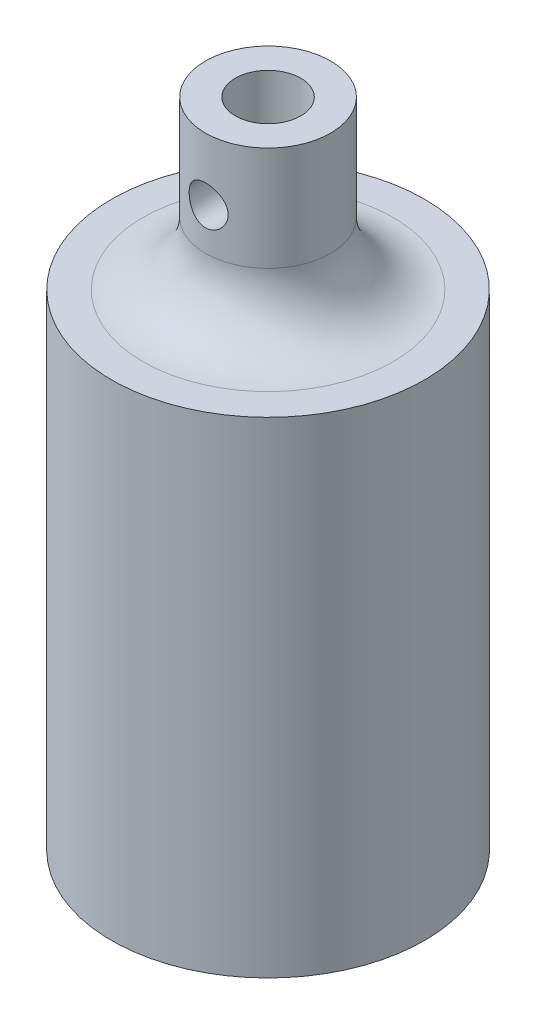
ISO-10303-21;
HEADER;
FILE_DESCRIPTION(('STEP AP214'),'2;1');
FILE_NAME('part.step','',(''),(''),'','','');
FILE_SCHEMA(('AUTOMOTIVE_DESIGN { 1 0 10303 214 1 1 1 1 }'));
ENDSEC;
DATA;
#1=APPLICATION_CONTEXT('core data for automotive mechanical design processes');
#2=APPLICATION_PROTOCOL_DEFINITION('international standard','automotive_design',2000,#1);
#3=PRODUCT_CONTEXT('',#1,'mechanical');
#4=PRODUCT('Part','Part','',(#3));
#5=PRODUCT_RELATED_PRODUCT_CATEGORY('part','',(#4));
#6=PRODUCT_DEFINITION_FORMATION('','',#4);
#7=PRODUCT_DEFINITION_CONTEXT('part definition',#1,'design');
#8=PRODUCT_DEFINITION('design','',#6,#7);
#9=PRODUCT_DEFINITION_SHAPE('','',#8);
#10=(LENGTH_UNIT() NAMED_UNIT(*) SI_UNIT(.MILLI.,.METRE.));
#11=(NAMED_UNIT(*) PLANE_ANGLE_UNIT() SI_UNIT($,.RADIAN.));
#12=(NAMED_UNIT(*) SI_UNIT($,.STERADIAN.) SOLID_ANGLE_UNIT());
#13=UNCERTAINTY_MEASURE_WITH_UNIT(LENGTH_MEASURE(1.E-05),#10,'distance_accuracy_value','');
#14=(GEOMETRIC_REPRESENTATION_CONTEXT(3) GLOBAL_UNCERTAINTY_ASSIGNED_CONTEXT((#13)) GLOBAL_UNIT_ASSIGNED_CONTEXT((#10,
#11,#12)) REPRESENTATION_CONTEXT('',''));
#15=CARTESIAN_POINT('',(0.,0.,0.));
#16=DIRECTION('',(0.,0.,1.));
#17=DIRECTION('',(1.,0.,0.));
#18=AXIS2_PLACEMENT_3D('',#15,#16,#17);
#19=CARTESIAN_POINT('',(0.,27.051,0.));
#20=DIRECTION('',(0.,1.,0.));
#21=DIRECTION('',(0.,0.,1.));
#22=AXIS2_PLACEMENT_3D('',#19,#20,#21);
#23=CYLINDRICAL_SURFACE('',#22,1.9939);
#24=CARTESIAN_POINT('',(0.,34.75355,1.9939));
#25=CARTESIAN_POINT('',(0.060814080758455,34.753552976939,1.99389728634744));
#26=CARTESIAN_POINT('',(0.121729723461206,34.7582546610524,1.9910872540621));
#27=CARTESIAN_POINT('',(0.241734607671098,34.7768231490229,1.98011440367248));
#28=CARTESIAN_POINT('',(0.300818769700695,34.7907134047522,1.97193788918477));
#29=CARTESIAN_POINT('',(0.415163546592239,34.8268839318832,1.95106073933573));
#30=CARTESIAN_POINT('',(0.470441522487163,34.8491226423559,1.93838253131428));
#31=CARTESIAN_POINT('',(0.57631031758627,34.901103309333,1.90958568878356));
#32=CARTESIAN_POINT('',(0.626902412867362,34.9308432148209,1.89346799490196));
#33=CARTESIAN_POINT('',(0.726307907612821,34.9994930165202,1.85771654573183));
#34=CARTESIAN_POINT('',(0.774695428736959,35.0389273053155,1.83790883757242));
#35=CARTESIAN_POINT('',(0.864585787833343,35.1246702051813,1.79737738898154));
#36=CARTESIAN_POINT('',(0.906079736858757,35.1709875481411,1.77665250881824));
#37=CARTESIAN_POINT('',(0.986068931893715,35.2757494431779,1.73366770815641));
#38=CARTESIAN_POINT('',(1.02360179904558,35.3349826750206,1.71152335531735));
#39=CARTESIAN_POINT('',(1.08803607896177,35.4602167274675,1.67130597699134));
#40=CARTESIAN_POINT('',(1.11495459495701,35.5262064431802,1.65322642214665));
#41=CARTESIAN_POINT('',(1.1517823394664,35.6470303880968,1.62770148288906));
#42=CARTESIAN_POINT('',(1.1642163154199,35.7007753614492,1.61874863175566));
#43=CARTESIAN_POINT('',(1.18149998436242,35.8100574660265,1.60617987435283));
#44=CARTESIAN_POINT('',(1.1863588916258,35.8655923359279,1.60255748443951));
#45=CARTESIAN_POINT('',(1.18821365755399,35.9769712587273,1.60118314972899));
#46=CARTESIAN_POINT('',(1.18519490009591,36.0328156942389,1.60344211711236));
#47=CARTESIAN_POINT('',(1.17145389992644,36.1430489851447,1.61350601234345));
#48=CARTESIAN_POINT('',(1.16072593727979,36.1974367286312,1.62131505808973));
#49=CARTESIAN_POINT('',(1.13229550881869,36.3027889231089,1.64129151245478));
#50=CARTESIAN_POINT('',(1.11467360645707,36.3537852284231,1.65340843457949));
#51=CARTESIAN_POINT('',(1.07309589389807,36.4522356728708,1.68069016266906));
#52=CARTESIAN_POINT('',(1.0491377455373,36.4996884961034,1.6958560932642));
#53=CARTESIAN_POINT('',(0.990799995367289,36.5984065230596,1.73069189249639));
#54=CARTESIAN_POINT('',(0.955335378866602,36.6489160688574,1.75068733512774));
#55=CARTESIAN_POINT('',(0.877130737946455,36.7437850757379,1.79115071606564));
#56=CARTESIAN_POINT('',(0.83438386698707,36.7881386773281,1.81161908320209));
#57=CARTESIAN_POINT('',(0.735952148011846,36.8755075679961,1.85398299164306));
#58=CARTESIAN_POINT('',(0.679299557671739,36.9175321441066,1.87569764304425));
#59=CARTESIAN_POINT('',(0.558416773681963,36.991339411579,1.91516072064334));
#60=CARTESIAN_POINT('',(0.494190804671451,37.0231277764025,1.93291134224284));
#61=CARTESIAN_POINT('',(0.364135048833109,37.0732453989736,1.96142370241393));
#62=CARTESIAN_POINT('',(0.298673735748199,37.0923084648734,1.97256134411408));
#63=CARTESIAN_POINT('',(0.164711185128663,37.1189455909947,1.98822434786049));
#64=CARTESIAN_POINT('',(0.0962135809522436,37.1265330207913,1.99275740428645));
#65=CARTESIAN_POINT('',(-0.0319449381101245,37.1295144132842,1.99453476074334));
#66=CARTESIAN_POINT('',(-0.0915646937674483,37.1264010603245,1.99267136924459));
#67=CARTESIAN_POINT('',(-0.209279074699433,37.111366975179,1.98376445536487));
#68=CARTESIAN_POINT('',(-0.26737372042157,37.0994463611364,1.97672100247087));
#69=CARTESIAN_POINT('',(-0.37921012419484,37.0677408990812,1.9583113351594));
#70=CARTESIAN_POINT('',(-0.43301939265196,37.0481342036212,1.94704328251747));
#71=CARTESIAN_POINT('',(-0.536580925037923,37.001819955291,1.92108598956423));
#72=CARTESIAN_POINT('',(-0.586332360851174,36.9751109577096,1.90639605326763));
#73=CARTESIAN_POINT('',(-0.685957592064811,36.9122474718216,1.87300257772166));
#74=CARTESIAN_POINT('',(-0.735305977369007,36.8753995278818,1.85404050787109));
#75=CARTESIAN_POINT('',(-0.827495298580985,36.7948404431378,1.81477415436333));
#76=CARTESIAN_POINT('',(-0.87032852955923,36.7511212986244,1.79446832163692));
#77=CARTESIAN_POINT('',(-0.953883512416788,36.6515566989156,1.75163236729128));
#78=CARTESIAN_POINT('',(-0.993639988539951,36.5948758668906,1.72914868989201));
#79=CARTESIAN_POINT('',(-1.06307421767295,36.4745906424851,1.6873517879675));
#80=CARTESIAN_POINT('',(-1.09276312466667,36.4109940160904,1.66803506707367));
#81=CARTESIAN_POINT('',(-1.13557724960321,36.2925183892995,1.63909138589378));
#82=CARTESIAN_POINT('',(-1.15089555351417,36.2387260322072,1.62827250038024));
#83=CARTESIAN_POINT('',(-1.17384727930482,36.1287848261933,1.61180768195928));
#84=CARTESIAN_POINT('',(-1.18149107189453,36.07263926444,1.60615476910756));
#85=CARTESIAN_POINT('',(-1.18866842936369,35.9593406532707,1.60085205935446));
#86=CARTESIAN_POINT('',(-1.18817397563399,35.902184800297,1.60122300151114));
#87=CARTESIAN_POINT('',(-1.17903791001395,35.7888756751246,1.60796018505792));
#88=CARTESIAN_POINT('',(-1.170391685584,35.732722988881,1.61432982070356));
#89=CARTESIAN_POINT('',(-1.14600324288999,35.6253782394202,1.63172383254599));
#90=CARTESIAN_POINT('',(-1.13058158924804,35.5740767052315,1.64253664242094));
#91=CARTESIAN_POINT('',(-1.09336585540144,35.4747319746394,1.66753988333922));
#92=CARTESIAN_POINT('',(-1.07156938388729,35.426690009306,1.68173158149255));
#93=CARTESIAN_POINT('',(-1.01835857867829,35.3272955849823,1.71455597977209));
#94=CARTESIAN_POINT('',(-0.985979338297984,35.2765753738422,1.73353603953796));
#95=CARTESIAN_POINT('',(-0.914167365336964,35.1807869454974,1.772457592727));
#96=CARTESIAN_POINT('',(-0.874728872751776,35.1357233953219,1.79239986148618));
#97=CARTESIAN_POINT('',(-0.782625131594729,35.0452723605275,1.83468988459786));
#98=CARTESIAN_POINT('',(-0.728855371004508,35.0009452945681,1.85692360236287));
#99=CARTESIAN_POINT('',(-0.613480643185146,34.9219007985321,1.89816399618569));
#100=CARTESIAN_POINT('',(-0.551873171503263,34.8871864514048,1.91716963619461));
#101=CARTESIAN_POINT('',(-0.424554005810462,34.8299241039312,1.94924270454899));
#102=CARTESIAN_POINT('',(-0.359065413800211,34.8069882202629,1.96249685831109));
#103=CARTESIAN_POINT('',(-0.224269242714761,34.7728669266873,1.98240742376365));
#104=CARTESIAN_POINT('',(-0.154977243367004,34.7616368693736,1.9890888988971));
#105=CARTESIAN_POINT('',(-0.0710568489889702,34.7555917145108,1.99268489380089));
#106=CARTESIAN_POINT('',(-0.0568618851108963,34.7548269399076,1.99313977429374));
#107=CARTESIAN_POINT('',(-0.0284464671490795,34.7538057275825,1.99374764887506));
#108=CARTESIAN_POINT('',(-0.0142260123860088,34.7535493036157,1.99390063479468));
#109=CARTESIAN_POINT('',(0.,34.75355,1.9939));
#110=B_SPLINE_CURVE_WITH_KNOTS('',3,(#24,#25,#26,#27,#28,#29,#30,#31,#32,#33,#34,#35,#36,#37,
#38,#39,#40,#41,#42,#43,#44,#45,#46,#47,#48,#49,#50,#51,#52,#53,#54,#55,#56,#57,#58,#59,#60,#61,
#62,#63,#64,#65,#66,#67,#68,#69,#70,#71,#72,#73,#74,#75,#76,#77,#78,#79,#80,#81,#82,#83,#84,#85,
#86,#87,#88,#89,#90,#91,#92,#93,#94,#95,#96,#97,#98,#99,#100,#101,#102,#103,#104,#105,#106,#107,
#108,#109),.UNSPECIFIED.,.T.,.F.,(4,2,2,2,2,2,2,2,2,2,2,2,2,2,2,2,2,2,2,2,2,2,2,2,2,2,2,2,2,2,2,
2,2,2,2,2,2,2,2,2,2,2,4),(0.,0.182380919102173,0.365229131968303,0.547178893510283,
0.729078959210013,0.924774156774015,1.12071976808234,1.34025469816955,1.55943442500307,
1.72638084151518,1.89312402638336,2.06017680438641,2.22735365730296,2.39263257029046,
2.55797255881401,2.75185048101899,2.94591169721056,3.16619589360327,3.38635778559206,
3.59236758474639,3.79813718886571,3.97643490030054,4.15473022003768,4.32911643792101,
4.50353815566161,4.69610014078295,4.88888811134615,5.10625291609611,5.3233761068202,
5.49357191933286,5.66353743227388,5.83408822983501,6.00473558859255,6.16805708354446,
6.33143992209331,6.52002209370851,6.70875884647444,6.92713416116852,7.14557943134126,
7.35627604601281,7.56616606515961,7.60882860284087,7.65149229489641),.UNSPECIFIED.);
#111=CARTESIAN_POINT('',(0.,34.75355,1.9939));
#112=VERTEX_POINT('',#111);
#113=EDGE_CURVE('E37',#112,#112,#110,.T.);
#114=ORIENTED_EDGE('',*,*,#113,.T.);
#115=EDGE_LOOP('',(#114));
#116=FACE_BOUND('',#115,.T.);
#117=CARTESIAN_POINT('',(0.,39.751,0.));
#118=DIRECTION('',(0.,1.,0.));
#119=DIRECTION('',(0.,0.,1.));
#120=AXIS2_PLACEMENT_3D('',#117,#118,#119);
#121=CIRCLE('',#120,1.9939);
#122=CARTESIAN_POINT('',(0.,39.751,1.9939));
#123=VERTEX_POINT('',#122);
#124=EDGE_CURVE('E55',#123,#123,#121,.T.);
#125=ORIENTED_EDGE('',*,*,#124,.T.);
#126=EDGE_LOOP('',(#125));
#127=FACE_BOUND('',#126,.T.);
#128=CARTESIAN_POINT('',(0.,27.94,0.));
#129=DIRECTION('',(0.,-1.,0.));
#130=DIRECTION('',(0.,0.,-1.));
#131=AXIS2_PLACEMENT_3D('',#128,#129,#130);
#132=CIRCLE('',#131,1.9939);
#133=CARTESIAN_POINT('',(0.,27.94,-1.9939));
#134=VERTEX_POINT('',#133);
#135=EDGE_CURVE('E52',#134,#134,#132,.F.);
#136=ORIENTED_EDGE('',*,*,#135,.F.);
#137=EDGE_LOOP('',(#136));
#138=FACE_BOUND('',#137,.T.);
#139=ADVANCED_FACE('F33',(#116,#127,#138),#23,.F.);
#140=CARTESIAN_POINT('',(0.,29.591,0.));
#141=DIRECTION('',(0.,1.,0.));
#142=DIRECTION('',(0.,0.,1.));
#143=AXIS2_PLACEMENT_3D('',#140,#141,#142);
#144=PLANE('',#143);
#145=CARTESIAN_POINT('',(0.,29.591,0.));
#146=DIRECTION('',(0.,1.,0.));
#147=DIRECTION('',(0.,0.,1.));
#148=AXIS2_PLACEMENT_3D('',#145,#146,#147);
#149=CIRCLE('',#148,7.62);
#150=CARTESIAN_POINT('',(0.,29.591,7.62));
#151=VERTEX_POINT('',#150);
#152=EDGE_CURVE('E10',#151,#151,#149,.F.);
#153=ORIENTED_EDGE('',*,*,#152,.T.);
#154=EDGE_LOOP('',(#153));
#155=FACE_BOUND('',#154,.T.);
#156=CARTESIAN_POINT('',(0.,29.591,0.));
#157=DIRECTION('',(0.,1.,0.));
#158=DIRECTION('',(0.,0.,1.));
#159=AXIS2_PLACEMENT_3D('',#156,#157,#158);
#160=CIRCLE('',#159,9.5377);
#161=CARTESIAN_POINT('',(0.,29.591,-9.5377));
#162=VERTEX_POINT('',#161);
#163=EDGE_CURVE('E49',#162,#162,#160,.T.);
#164=ORIENTED_EDGE('',*,*,#163,.T.);
#165=EDGE_LOOP('',(#164));
#166=FACE_BOUND('',#165,.T.);
#167=ADVANCED_FACE('F97',(#155,#166),#144,.T.);
#168=CARTESIAN_POINT('',(0.,29.591,0.));
#169=DIRECTION('',(0.,-1.,0.));
#170=DIRECTION('',(0.,0.,-1.));
#171=AXIS2_PLACEMENT_3D('',#168,#169,#170);
#172=CYLINDRICAL_SURFACE('',#171,9.5377);
#173=CARTESIAN_POINT('',(0.,0.,0.));
#174=DIRECTION('',(0.,1.,0.));
#175=DIRECTION('',(0.,0.,1.));
#176=AXIS2_PLACEMENT_3D('',#173,#174,#175);
#177=CIRCLE('',#176,9.5377);
#178=CARTESIAN_POINT('',(0.,0.,-9.5377));
#179=VERTEX_POINT('',#178);
#180=EDGE_CURVE('E57',#179,#179,#177,.T.);
#181=CARTESIAN_POINT('',(0.,29.591,-9.5377));
#182=CARTESIAN_POINT('',(0.,29.2827604166667,-9.5377));
#183=CARTESIAN_POINT('',(0.,28.9745208333333,-9.5377));
#184=CARTESIAN_POINT('',(0.,28.3580416666667,-9.5377));
#185=CARTESIAN_POINT('',(0.,28.0498020833333,-9.5377));
#186=CARTESIAN_POINT('',(0.,27.4333229166667,-9.5377));
#187=CARTESIAN_POINT('',(0.,27.1250833333333,-9.5377));
#188=CARTESIAN_POINT('',(0.,26.5086041666667,-9.5377));
#189=CARTESIAN_POINT('',(0.,26.2003645833333,-9.5377));
#190=CARTESIAN_POINT('',(0.,25.5838854166667,-9.5377));
#191=CARTESIAN_POINT('',(0.,25.2756458333333,-9.5377));
#192=CARTESIAN_POINT('',(0.,24.6591666666667,-9.5377));
#193=CARTESIAN_POINT('',(0.,24.3509270833333,-9.5377));
#194=CARTESIAN_POINT('',(0.,23.7344479166667,-9.5377));
#195=CARTESIAN_POINT('',(0.,23.4262083333333,-9.5377));
#196=CARTESIAN_POINT('',(0.,22.8097291666667,-9.5377));
#197=CARTESIAN_POINT('',(0.,22.5014895833333,-9.5377));
#198=CARTESIAN_POINT('',(0.,21.8850104166667,-9.5377));
#199=CARTESIAN_POINT('',(0.,21.5767708333333,-9.5377));
#200=CARTESIAN_POINT('',(0.,20.9602916666667,-9.5377));
#201=CARTESIAN_POINT('',(0.,20.6520520833333,-9.5377));
#202=CARTESIAN_POINT('',(0.,20.0355729166667,-9.5377));
#203=CARTESIAN_POINT('',(0.,19.7273333333333,-9.5377));
#204=CARTESIAN_POINT('',(0.,19.1108541666667,-9.5377));
#205=CARTESIAN_POINT('',(0.,18.8026145833333,-9.5377));
#206=CARTESIAN_POINT('',(0.,18.1861354166667,-9.5377));
#207=CARTESIAN_POINT('',(0.,17.8778958333333,-9.5377));
#208=CARTESIAN_POINT('',(0.,17.2614166666667,-9.5377));
#209=CARTESIAN_POINT('',(0.,16.9531770833333,-9.5377));
#210=CARTESIAN_POINT('',(0.,16.3366979166667,-9.5377));
#211=CARTESIAN_POINT('',(0.,16.0284583333333,-9.5377));
#212=CARTESIAN_POINT('',(0.,15.4119791666667,-9.5377));
#213=CARTESIAN_POINT('',(0.,15.1037395833333,-9.5377));
#214=CARTESIAN_POINT('',(0.,14.4872604166667,-9.5377));
#215=CARTESIAN_POINT('',(0.,14.1790208333333,-9.5377));
#216=CARTESIAN_POINT('',(0.,13.5625416666667,-9.5377));
#217=CARTESIAN_POINT('',(0.,13.2543020833333,-9.5377));
#218=CARTESIAN_POINT('',(0.,12.6378229166667,-9.5377));
#219=CARTESIAN_POINT('',(0.,12.3295833333333,-9.5377));
#220=CARTESIAN_POINT('',(0.,11.7131041666667,-9.5377));
#221=CARTESIAN_POINT('',(0.,11.4048645833333,-9.5377));
#222=CARTESIAN_POINT('',(0.,10.7883854166667,-9.5377));
#223=CARTESIAN_POINT('',(0.,10.4801458333333,-9.5377));
#224=CARTESIAN_POINT('',(0.,9.86366666666667,-9.5377));
#225=CARTESIAN_POINT('',(0.,9.55542708333333,-9.5377));
#226=CARTESIAN_POINT('',(0.,8.93894791666667,-9.5377));
#227=CARTESIAN_POINT('',(0.,8.63070833333333,-9.5377));
#228=CARTESIAN_POINT('',(0.,8.01422916666667,-9.5377));
#229=CARTESIAN_POINT('',(0.,7.70598958333333,-9.5377));
#230=CARTESIAN_POINT('',(0.,7.08951041666666,-9.5377));
#231=CARTESIAN_POINT('',(0.,6.78127083333333,-9.5377));
#232=CARTESIAN_POINT('',(0.,6.16479166666666,-9.5377));
#233=CARTESIAN_POINT('',(0.,5.85655208333333,-9.5377));
#234=CARTESIAN_POINT('',(0.,5.24007291666666,-9.5377));
#235=CARTESIAN_POINT('',(0.,4.93183333333333,-9.5377));
#236=CARTESIAN_POINT('',(0.,4.31535416666666,-9.5377));
#237=CARTESIAN_POINT('',(0.,4.00711458333333,-9.5377));
#238=CARTESIAN_POINT('',(0.,3.39063541666666,-9.5377));
#239=CARTESIAN_POINT('',(0.,3.08239583333333,-9.5377));
#240=CARTESIAN_POINT('',(0.,2.46591666666666,-9.5377));
#241=CARTESIAN_POINT('',(0.,2.15767708333333,-9.5377));
#242=CARTESIAN_POINT('',(0.,1.54119791666666,-9.5377));
#243=CARTESIAN_POINT('',(0.,1.23295833333333,-9.5377));
#244=CARTESIAN_POINT('',(0.,0.616479166666664,-9.5377));
#245=CARTESIAN_POINT('',(0.,0.308239583333331,-9.5377));
#246=CARTESIAN_POINT('',(0.,0.,-9.5377));
#247=B_SPLINE_CURVE_WITH_KNOTS('',3,(#181,#182,#183,#184,#185,#186,#187,#188,#189,#190,#191,
#192,#193,#194,#195,#196,#197,#198,#199,#200,#201,#202,#203,#204,#205,#206,#207,#208,#209,#210,
#211,#212,#213,#214,#215,#216,#217,#218,#219,#220,#221,#222,#223,#224,#225,#226,#227,#228,#229,
#230,#231,#232,#233,#234,#235,#236,#237,#238,#239,#240,#241,#242,#243,#244,#245,#246),
.UNSPECIFIED.,.F.,.F.,(4,2,2,2,2,2,2,2,2,2,2,2,2,2,2,2,2,2,2,2,2,2,2,2,2,2,2,2,2,2,2,2,4),(0.,
0.924718750000001,1.8494375,2.77415625,3.698875,4.62359375,5.5483125,6.47303125,7.39775,
8.32246875,9.2471875,10.17190625,11.096625,12.02134375,12.9460625,13.87078125,14.7955,
15.72021875,16.6449375,17.56965625,18.494375,19.41909375,20.3438125,21.26853125,22.19325,
23.11796875,24.0426875,24.96740625,25.892125,26.81684375,27.7415625,28.66628125,29.591),.UNSPECIFIED.);
#248=EDGE_CURVE('BSEAM117',#162,#179,#247,.T.);
#249=ORIENTED_EDGE('',*,*,#163,.F.);
#250=ORIENTED_EDGE('',*,*,#180,.T.);
#251=ORIENTED_EDGE('',*,*,#248,.T.);
#252=ORIENTED_EDGE('',*,*,#248,.F.);
#253=EDGE_LOOP('',(#249,#251,#250,#252));
#254=FACE_BOUND('',#253,.T.);
#255=ADVANCED_FACE('F117',(#254),#172,.T.);
#256=CARTESIAN_POINT('',(0.,0.,0.));
#257=DIRECTION('',(0.,1.,0.));
#258=DIRECTION('',(0.,0.,1.));
#259=AXIS2_PLACEMENT_3D('',#256,#257,#258);
#260=PLANE('',#259);
#261=CARTESIAN_POINT('',(0.,0.,0.));
#262=DIRECTION('',(0.,-1.,0.));
#263=DIRECTION('',(0.,0.,-1.));
#264=AXIS2_PLACEMENT_3D('',#261,#262,#263);
#265=CIRCLE('',#264,8.4836);
#266=CARTESIAN_POINT('',(0.,0.,-8.4836));
#267=VERTEX_POINT('',#266);
#268=EDGE_CURVE('E67',#267,#267,#265,.T.);
#269=ORIENTED_EDGE('',*,*,#268,.F.);
#270=EDGE_LOOP('',(#269));
#271=FACE_BOUND('',#270,.T.);
#272=ORIENTED_EDGE('',*,*,#180,.F.);
#273=EDGE_LOOP('',(#272));
#274=FACE_BOUND('',#273,.T.);
#275=ADVANCED_FACE('F104',(#271,#274),#260,.F.);
#276=CARTESIAN_POINT('',(0.,39.751,0.));
#277=DIRECTION('',(0.,-1.,0.));
#278=DIRECTION('',(0.,0.,-1.));
#279=AXIS2_PLACEMENT_3D('',#276,#277,#278);
#280=CYLINDRICAL_SURFACE('',#279,3.81);
#281=CARTESIAN_POINT('',(1.18744999999999,35.941,3.62022961944405));
#282=CARTESIAN_POINT('',(1.18744953453094,35.8760634588994,3.62023003981501));
#283=CARTESIAN_POINT('',(1.18210526250786,35.8111222140283,3.6219958983267));
#284=CARTESIAN_POINT('',(1.16093012556618,35.6831469753299,3.62883751366045));
#285=CARTESIAN_POINT('',(1.1450963821221,35.6201135100026,3.63391417902967));
#286=CARTESIAN_POINT('',(1.10353909970848,35.4978259634549,3.64674777481537));
#287=CARTESIAN_POINT('',(1.07783298914474,35.4385654353152,3.65449997947817));
#288=CARTESIAN_POINT('',(1.01731876915113,35.3251818560044,3.67180462169701));
#289=CARTESIAN_POINT('',(0.982509068033482,35.271059705494,3.68135737398231));
#290=CARTESIAN_POINT('',(0.903502076172814,35.1676399463772,3.70155284231004));
#291=CARTESIAN_POINT('',(0.859047363210285,35.1185437505216,3.71222015732882));
#292=CARTESIAN_POINT('',(0.762563144679564,35.0283685367365,3.73323344604002));
#293=CARTESIAN_POINT('',(0.710532589019621,34.9872906320772,3.74357937494332));
#294=CARTESIAN_POINT('',(0.598927255286738,34.9134302213039,3.76306543278811));
#295=CARTESIAN_POINT('',(0.539209153511798,34.8808549997811,3.77217321956445));
#296=CARTESIAN_POINT('',(0.414809744358042,34.826289153534,3.78786963393591));
#297=CARTESIAN_POINT('',(0.350129601097662,34.8042960549447,3.79445885024269));
#298=CARTESIAN_POINT('',(0.219750912727561,34.7721908569305,3.8042015855461));
#299=CARTESIAN_POINT('',(0.154144687307477,34.7617345400119,3.80745442748675));
#300=CARTESIAN_POINT('',(0.0220337927689549,34.7519092464635,3.81050862997963));
#301=CARTESIAN_POINT('',(-0.0444706697711554,34.7525377624896,3.81031077106646));
#302=CARTESIAN_POINT('',(-0.174068102055111,34.7646375421483,3.80655509440359));
#303=CARTESIAN_POINT('',(-0.237199793738551,34.7757356842405,3.80311290348851));
#304=CARTESIAN_POINT('',(-0.360655368499734,34.8078476400622,3.7933974272972));
#305=CARTESIAN_POINT('',(-0.420979068508887,34.8288620992997,3.78712395771856));
#306=CARTESIAN_POINT('',(-0.537968951267811,34.8804507784825,3.77229528508045));
#307=CARTESIAN_POINT('',(-0.594581529629357,34.9111385069445,3.76371317691505));
#308=CARTESIAN_POINT('',(-0.701969867795716,34.9811116381806,3.74517185859392));
#309=CARTESIAN_POINT('',(-0.752744152717956,35.0203992062187,3.73521230185771));
#310=CARTESIAN_POINT('',(-0.849239582740271,35.1083737427269,3.71448919177509));
#311=CARTESIAN_POINT('',(-0.89466391698945,35.1573828976864,3.70370942459723));
#312=CARTESIAN_POINT('',(-0.976737192697097,35.2624242638842,3.68291753822987));
#313=CARTESIAN_POINT('',(-1.01338511196208,35.3184572920397,3.67290550855136));
#314=CARTESIAN_POINT('',(-1.07720814056313,35.4367905752741,3.65470120122804));
#315=CARTESIAN_POINT('',(-1.10427390446211,35.4991533373084,3.6465302932589));
#316=CARTESIAN_POINT('',(-1.14742681778024,35.6278672787644,3.6331842526469));
#317=CARTESIAN_POINT('',(-1.16351788678224,35.6942170250236,3.62800805055318));
#318=CARTESIAN_POINT('',(-1.1836932290755,35.8261791177887,3.62147469668488));
#319=CARTESIAN_POINT('',(-1.18823178698421,35.8917149036245,3.61997314153136));
#320=CARTESIAN_POINT('',(-1.18644813362066,36.0226159656234,3.62055828057471));
#321=CARTESIAN_POINT('',(-1.18012758959497,36.0879812664189,3.62264442393619));
#322=CARTESIAN_POINT('',(-1.15721104298943,36.214734201766,3.63002739426551));
#323=CARTESIAN_POINT('',(-1.14091529252866,36.2761821575593,3.63523031235912));
#324=CARTESIAN_POINT('',(-1.09886313425325,36.3954649848236,3.64816124672484));
#325=CARTESIAN_POINT('',(-1.07310518887048,36.4532992672992,3.65588967335925));
#326=CARTESIAN_POINT('',(-1.01202030024921,36.565540636531,3.67327482709197));
#327=CARTESIAN_POINT('',(-0.976441109965937,36.6198026964885,3.68298031643455));
#328=CARTESIAN_POINT('',(-0.897018518458733,36.721751698422,3.70312481545832));
#329=CARTESIAN_POINT('',(-0.853172981796701,36.7694369358893,3.71356401424001));
#330=CARTESIAN_POINT('',(-0.756313857368945,36.8589046918477,3.73452001631575));
#331=CARTESIAN_POINT('',(-0.702997025409274,36.9003631716574,3.74502230465622));
#332=CARTESIAN_POINT('',(-0.589909330712405,36.9737570969068,3.76449120523457));
#333=CARTESIAN_POINT('',(-0.530138765756691,37.0056929814727,3.77345788827743));
#334=CARTESIAN_POINT('',(-0.406210392356931,37.058828619205,3.78879379565901));
#335=CARTESIAN_POINT('',(-0.342088443678028,37.0801063066724,3.7951818067878));
#336=CARTESIAN_POINT('',(-0.210942121856101,37.1115056099947,3.80472327146195));
#337=CARTESIAN_POINT('',(-0.143918658397137,37.1216306964659,3.80787773124611));
#338=CARTESIAN_POINT('',(-0.0118554791382485,37.1301566633491,3.81053036853485));
#339=CARTESIAN_POINT('',(0.0531514370524401,37.1290257282428,3.81017455826865));
#340=CARTESIAN_POINT('',(0.182007322285003,37.1162030732027,3.80619599193848));
#341=CARTESIAN_POINT('',(0.245856365868356,37.1045120355867,3.80257344694733));
#342=CARTESIAN_POINT('',(0.369807606443019,37.0711985996521,3.79251433159985));
#343=CARTESIAN_POINT('',(0.429946409783747,37.0497009725356,3.7861131623624));
#344=CARTESIAN_POINT('',(0.545792684313997,36.9974972241416,3.77115706055494));
#345=CARTESIAN_POINT('',(0.601499395347511,36.966789527518,3.7626017595694));
#346=CARTESIAN_POINT('',(0.708948336192558,36.8958369738483,3.74387079389865));
#347=CARTESIAN_POINT('',(0.76049298383609,36.8553048993097,3.73365014277526));
#348=CARTESIAN_POINT('',(0.856204592301,36.7663614360474,3.71287179368437));
#349=CARTESIAN_POINT('',(0.900369343366987,36.7179476958605,3.7023139958885));
#350=CARTESIAN_POINT('',(0.981533373157339,36.6127057239657,3.6816445789342));
#351=CARTESIAN_POINT('',(1.01824907781136,36.5556530456806,3.67155906982585));
#352=CARTESIAN_POINT('',(1.08153095868632,36.4358846109759,3.65342037055192));
#353=CARTESIAN_POINT('',(1.10810129350971,36.3731711879655,3.64536634813736));
#354=CARTESIAN_POINT('',(1.14836768065048,36.24945853788,3.63287184514288));
#355=CARTESIAN_POINT('',(1.16298068619849,36.1887826312352,3.62817848317578));
#356=CARTESIAN_POINT('',(1.18252089244791,36.0657389863016,3.62185754097825));
#357=CARTESIAN_POINT('',(1.18745044708384,36.0033716629146,3.620229215677));
#358=CARTESIAN_POINT('',(1.18744999999999,35.941,3.62022961944405));
#359=B_SPLINE_CURVE_WITH_KNOTS('',3,(#281,#282,#283,#284,#285,#286,#287,#288,#289,#290,#291,
#292,#293,#294,#295,#296,#297,#298,#299,#300,#301,#302,#303,#304,#305,#306,#307,#308,#309,#310,
#311,#312,#313,#314,#315,#316,#317,#318,#319,#320,#321,#322,#323,#324,#325,#326,#327,#328,#329,
#330,#331,#332,#333,#334,#335,#336,#337,#338,#339,#340,#341,#342,#343,#344,#345,#346,#347,#348,
#349,#350,#351,#352,#353,#354,#355,#356,#357,#358),.UNSPECIFIED.,.T.,.F.,(4,2,2,2,2,2,2,2,2,2,2,
2,2,2,2,2,2,2,2,2,2,2,2,2,2,2,2,2,2,2,2,2,2,2,2,2,2,2,4),(0.,0.194579247096456,
0.389211912848712,0.583502547253236,0.7778271745109,0.978172077232626,1.17854477635516,
1.38342274862223,1.58825280167557,1.78679069937523,1.98528368918735,2.17695969272935,
2.36864817524342,2.56267541039245,2.75675155394024,2.95887472608229,3.16102142817543,
3.36540570586825,3.56971694998717,3.76586034712791,3.9619736321851,4.15245587978073,
4.34296909366701,4.53892257779325,4.73492675194653,4.93900438080384,5.14307259734259,
5.34562602158124,5.5481163946966,5.7422207581349,5.93631258084779,6.12800099349555,
6.31972221240546,6.51792214831946,6.71618132511722,6.92096373398819,7.12566211189706,
7.31260127225354,7.49949498424337),.UNSPECIFIED.);
#360=CARTESIAN_POINT('',(1.18744999999999,35.941,3.62022961944405));
#361=VERTEX_POINT('',#360);
#362=EDGE_CURVE('E70',#361,#361,#359,.T.);
#363=ORIENTED_EDGE('',*,*,#362,.T.);
#364=EDGE_LOOP('',(#363));
#365=FACE_BOUND('',#364,.T.);
#366=CARTESIAN_POINT('',(0.,33.401,0.));
#367=DIRECTION('',(0.,1.,0.));
#368=DIRECTION('',(0.,0.,1.));
#369=AXIS2_PLACEMENT_3D('',#366,#367,#368);
#370=CIRCLE('',#369,3.81);
#371=CARTESIAN_POINT('',(0.,33.401,3.81));
#372=VERTEX_POINT('',#371);
#373=EDGE_CURVE('E45',#372,#372,#370,.T.);
#374=ORIENTED_EDGE('',*,*,#373,.T.);
#375=EDGE_LOOP('',(#374));
#376=FACE_BOUND('',#375,.T.);
#377=CARTESIAN_POINT('',(0.,39.751,0.));
#378=DIRECTION('',(0.,1.,0.));
#379=DIRECTION('',(0.,0.,1.));
#380=AXIS2_PLACEMENT_3D('',#377,#378,#379);
#381=CIRCLE('',#380,3.81);
#382=CARTESIAN_POINT('',(0.,39.751,3.81));
#383=VERTEX_POINT('',#382);
#384=EDGE_CURVE('E60',#383,#383,#381,.T.);
#385=ORIENTED_EDGE('',*,*,#384,.F.);
#386=EDGE_LOOP('',(#385));
#387=FACE_BOUND('',#386,.T.);
#388=ADVANCED_FACE('F77',(#365,#376,#387),#280,.T.);
#389=CARTESIAN_POINT('',(0.,39.751,0.));
#390=DIRECTION('',(0.,1.,0.));
#391=DIRECTION('',(0.,0.,1.));
#392=AXIS2_PLACEMENT_3D('',#389,#390,#391);
#393=PLANE('',#392);
#394=ORIENTED_EDGE('',*,*,#124,.F.);
#395=EDGE_LOOP('',(#394));
#396=FACE_BOUND('',#395,.T.);
#397=ORIENTED_EDGE('',*,*,#384,.T.);
#398=EDGE_LOOP('',(#397));
#399=FACE_BOUND('',#398,.T.);
#400=ADVANCED_FACE('F91',(#396,#399),#393,.T.);
#401=CARTESIAN_POINT('',(0.,27.94,0.));
#402=DIRECTION('',(0.,-1.,0.));
#403=DIRECTION('',(0.,0.,-1.));
#404=AXIS2_PLACEMENT_3D('',#401,#402,#403);
#405=PLANE('',#404);
#406=CARTESIAN_POINT('',(0.,27.94,0.));
#407=DIRECTION('',(0.,-1.,0.));
#408=DIRECTION('',(0.,0.,-1.));
#409=AXIS2_PLACEMENT_3D('',#406,#407,#408);
#410=CIRCLE('',#409,8.4836);
#411=CARTESIAN_POINT('',(0.,27.94,-8.4836));
#412=VERTEX_POINT('',#411);
#413=EDGE_CURVE('E56',#412,#412,#410,.T.);
#414=ORIENTED_EDGE('',*,*,#413,.T.);
#415=EDGE_LOOP('',(#414));
#416=FACE_BOUND('',#415,.T.);
#417=ORIENTED_EDGE('',*,*,#135,.T.);
#418=EDGE_LOOP('',(#417));
#419=FACE_BOUND('',#418,.T.);
#420=ADVANCED_FACE('F86',(#416,#419),#405,.T.);
#421=CARTESIAN_POINT('',(0.,27.94,0.));
#422=DIRECTION('',(0.,-1.,0.));
#423=DIRECTION('',(0.,0.,-1.));
#424=AXIS2_PLACEMENT_3D('',#421,#422,#423);
#425=CYLINDRICAL_SURFACE('',#424,8.4836);
#426=ORIENTED_EDGE('',*,*,#413,.F.);
#427=EDGE_LOOP('',(#426));
#428=FACE_BOUND('',#427,.T.);
#429=ORIENTED_EDGE('',*,*,#268,.T.);
#430=EDGE_LOOP('',(#429));
#431=FACE_BOUND('',#430,.T.);
#432=ADVANCED_FACE('F90',(#428,#431),#425,.F.);
#433=CARTESIAN_POINT('',(0.,33.401,0.));
#434=DIRECTION('',(0.,1.,0.));
#435=DIRECTION('',(0.,0.,1.));
#436=AXIS2_PLACEMENT_3D('',#433,#434,#435);
#437=TOROIDAL_SURFACE('',#436,7.62,3.81);
#438=ORIENTED_EDGE('',*,*,#152,.F.);
#439=EDGE_LOOP('',(#438));
#440=FACE_BOUND('',#439,.T.);
#441=ORIENTED_EDGE('',*,*,#373,.F.);
#442=EDGE_LOOP('',(#441));
#443=FACE_BOUND('',#442,.T.);
#444=ADVANCED_FACE('F35',(#440,#443),#437,.F.);
#445=CARTESIAN_POINT('',(0.,35.941,9.5377));
#446=DIRECTION('',(0.,0.,1.));
#447=DIRECTION('',(1.,0.,0.));
#448=AXIS2_PLACEMENT_3D('',#445,#446,#447);
#449=CYLINDRICAL_SURFACE('',#448,1.18744999999999);
#450=ORIENTED_EDGE('',*,*,#113,.F.);
#451=EDGE_LOOP('',(#450));
#452=FACE_BOUND('',#451,.T.);
#453=ORIENTED_EDGE('',*,*,#362,.F.);
#454=EDGE_LOOP('',(#453));
#455=FACE_BOUND('',#454,.T.);
#456=ADVANCED_FACE('F81',(#452,#455),#449,.F.);
#457=CLOSED_SHELL('',(#139,#167,#255,#275,#388,#400,#420,#432,#444,#456));
#458=MANIFOLD_SOLID_BREP('B2',#457);
#459=ADVANCED_BREP_SHAPE_REPRESENTATION('',(#18,#458),#14);
#460=SHAPE_DEFINITION_REPRESENTATION(#9,#459);
ENDSEC;
END-ISO-10303-21;
